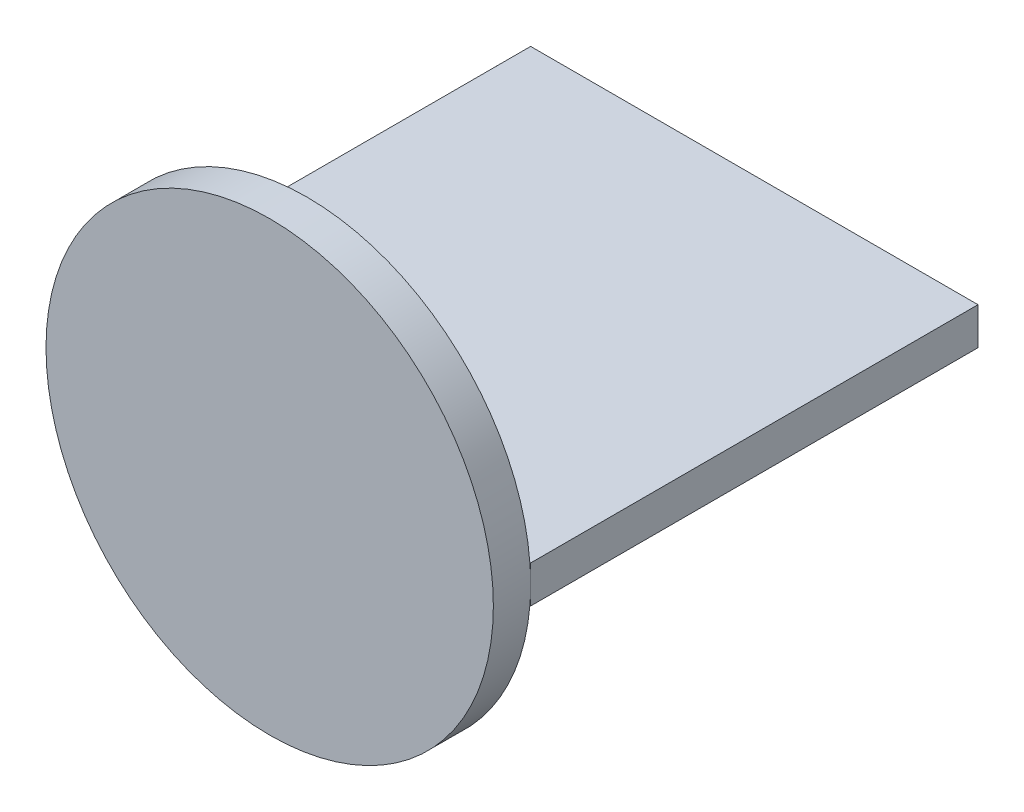
ISO-10303-21;
HEADER;
FILE_DESCRIPTION(('STEP AP214'),'2;1');
FILE_NAME('part.step','',(''),(''),'','','');
FILE_SCHEMA(('AUTOMOTIVE_DESIGN { 1 0 10303 214 1 1 1 1 }'));
ENDSEC;
DATA;
#1=APPLICATION_CONTEXT('core data for automotive mechanical design processes');
#2=APPLICATION_PROTOCOL_DEFINITION('international standard','automotive_design',2000,#1);
#3=PRODUCT_CONTEXT('',#1,'mechanical');
#4=PRODUCT('Part','Part','',(#3));
#5=PRODUCT_RELATED_PRODUCT_CATEGORY('part','',(#4));
#6=PRODUCT_DEFINITION_FORMATION('','',#4);
#7=PRODUCT_DEFINITION_CONTEXT('part definition',#1,'design');
#8=PRODUCT_DEFINITION('design','',#6,#7);
#9=PRODUCT_DEFINITION_SHAPE('','',#8);
#10=(LENGTH_UNIT() NAMED_UNIT(*) SI_UNIT(.MILLI.,.METRE.));
#11=(NAMED_UNIT(*) PLANE_ANGLE_UNIT() SI_UNIT($,.RADIAN.));
#12=(NAMED_UNIT(*) SI_UNIT($,.STERADIAN.) SOLID_ANGLE_UNIT());
#13=UNCERTAINTY_MEASURE_WITH_UNIT(LENGTH_MEASURE(1.E-05),#10,'distance_accuracy_value','');
#14=(GEOMETRIC_REPRESENTATION_CONTEXT(3) GLOBAL_UNCERTAINTY_ASSIGNED_CONTEXT((#13)) GLOBAL_UNIT_ASSIGNED_CONTEXT((#10,
#11,#12)) REPRESENTATION_CONTEXT('',''));
#15=CARTESIAN_POINT('',(0.,0.,0.));
#16=DIRECTION('',(0.,0.,1.));
#17=DIRECTION('',(1.,0.,0.));
#18=AXIS2_PLACEMENT_3D('',#15,#16,#17);
#19=CARTESIAN_POINT('',(0.,0.,10.));
#20=DIRECTION('',(0.,0.,-1.));
#21=DIRECTION('',(-1.,0.,0.));
#22=AXIS2_PLACEMENT_3D('',#19,#20,#21);
#23=CYLINDRICAL_SURFACE('',#22,30.);
#24=CARTESIAN_POINT('',(0.,0.,0.));
#25=DIRECTION('',(0.,0.,1.));
#26=DIRECTION('',(1.,0.,0.));
#27=AXIS2_PLACEMENT_3D('',#24,#25,#26);
#28=CIRCLE('',#27,30.);
#29=CARTESIAN_POINT('',(30.,0.,0.));
#30=VERTEX_POINT('',#29);
#31=CARTESIAN_POINT('',(29.8956518577535,2.5,0.));
#32=VERTEX_POINT('',#31);
#33=EDGE_CURVE('E80',#30,#32,#28,.T.);
#34=ORIENTED_EDGE('',*,*,#33,.T.);
#35=CARTESIAN_POINT('',(-29.8956518577535,2.5,0.));
#36=VERTEX_POINT('',#35);
#37=EDGE_CURVE('E202',#32,#36,#28,.T.);
#38=ORIENTED_EDGE('',*,*,#37,.T.);
#39=CARTESIAN_POINT('',(-30.,0.,0.));
#40=VERTEX_POINT('',#39);
#41=EDGE_CURVE('E101',#36,#40,#28,.T.);
#42=ORIENTED_EDGE('',*,*,#41,.T.);
#43=CARTESIAN_POINT('',(-29.8956518577535,-2.5,0.));
#44=VERTEX_POINT('',#43);
#45=EDGE_CURVE('E220',#40,#44,#28,.T.);
#46=ORIENTED_EDGE('',*,*,#45,.T.);
#47=CARTESIAN_POINT('',(29.8956518577535,-2.5,0.));
#48=VERTEX_POINT('',#47);
#49=EDGE_CURVE('E221',#44,#48,#28,.T.);
#50=ORIENTED_EDGE('',*,*,#49,.T.);
#51=EDGE_CURVE('E185',#48,#30,#28,.T.);
#52=ORIENTED_EDGE('',*,*,#51,.T.);
#53=EDGE_LOOP('',(#34,#38,#42,#46,#50,#52));
#54=FACE_BOUND('',#53,.T.);
#55=CARTESIAN_POINT('',(0.,0.,5.));
#56=DIRECTION('',(0.,0.,1.));
#57=DIRECTION('',(1.,0.,0.));
#58=AXIS2_PLACEMENT_3D('',#55,#56,#57);
#59=CIRCLE('',#58,30.);
#60=CARTESIAN_POINT('',(30.,0.,5.));
#61=VERTEX_POINT('',#60);
#62=EDGE_CURVE('E187',#61,#61,#59,.T.);
#63=ORIENTED_EDGE('',*,*,#62,.F.);
#64=EDGE_LOOP('',(#63));
#65=FACE_BOUND('',#64,.T.);
#66=ADVANCED_FACE('F77',(#54,#65),#23,.T.);
#67=CARTESIAN_POINT('',(0.,0.,0.));
#68=DIRECTION('',(0.,0.,1.));
#69=DIRECTION('',(1.,0.,0.));
#70=AXIS2_PLACEMENT_3D('',#67,#68,#69);
#71=PLANE('',#70);
#72=DIRECTION('',(-1.,0.,0.));
#73=VECTOR('',#72,1.);
#74=CARTESIAN_POINT('',(0.,-2.5,0.));
#75=LINE('',#74,#73);
#76=EDGE_CURVE('E85',#48,#44,#75,.T.);
#77=ORIENTED_EDGE('',*,*,#76,.F.);
#78=ORIENTED_EDGE('',*,*,#49,.F.);
#79=EDGE_LOOP('',(#77,#78));
#80=FACE_BOUND('',#79,.T.);
#81=ADVANCED_FACE('F194',(#80),#71,.F.);
#82=ORIENTED_EDGE('',*,*,#37,.F.);
#83=DIRECTION('',(-1.,0.,0.));
#84=VECTOR('',#83,1.);
#85=CARTESIAN_POINT('',(0.,2.5,0.));
#86=LINE('',#85,#84);
#87=EDGE_CURVE('E12',#32,#36,#86,.T.);
#88=ORIENTED_EDGE('',*,*,#87,.T.);
#89=EDGE_LOOP('',(#82,#88));
#90=FACE_BOUND('',#89,.T.);
#91=ADVANCED_FACE('F198',(#90),#71,.F.);
#92=CARTESIAN_POINT('',(0.,0.,0.));
#93=DIRECTION('',(0.,0.,-1.));
#94=DIRECTION('',(-1.,0.,0.));
#95=AXIS2_PLACEMENT_3D('',#92,#93,#94);
#96=PLANE('',#95);
#97=ORIENTED_EDGE('',*,*,#41,.F.);
#98=CARTESIAN_POINT('',(-30.,2.5,0.));
#99=VERTEX_POINT('',#98);
#100=EDGE_CURVE('E88',#36,#99,#86,.T.);
#101=ORIENTED_EDGE('',*,*,#100,.T.);
#102=DIRECTION('',(0.,1.,0.));
#103=VECTOR('',#102,1.);
#104=CARTESIAN_POINT('',(-30.,-2.5,0.));
#105=LINE('',#104,#103);
#106=EDGE_CURVE('E166',#40,#99,#105,.T.);
#107=ORIENTED_EDGE('',*,*,#106,.F.);
#108=EDGE_LOOP('',(#97,#101,#107));
#109=FACE_BOUND('',#108,.T.);
#110=ADVANCED_FACE('F223',(#109),#96,.F.);
#111=ORIENTED_EDGE('',*,*,#45,.F.);
#112=CARTESIAN_POINT('',(-30.,-2.5,0.));
#113=VERTEX_POINT('',#112);
#114=EDGE_CURVE('E179',#113,#40,#105,.T.);
#115=ORIENTED_EDGE('',*,*,#114,.F.);
#116=EDGE_CURVE('E182',#44,#113,#75,.T.);
#117=ORIENTED_EDGE('',*,*,#116,.F.);
#118=EDGE_LOOP('',(#111,#115,#117));
#119=FACE_BOUND('',#118,.T.);
#120=ADVANCED_FACE('F219',(#119),#96,.F.);
#121=ORIENTED_EDGE('',*,*,#33,.F.);
#122=DIRECTION('',(0.,1.,0.));
#123=VECTOR('',#122,1.);
#124=CARTESIAN_POINT('',(30.,-2.5,0.));
#125=LINE('',#124,#123);
#126=CARTESIAN_POINT('',(30.,2.5,0.));
#127=VERTEX_POINT('',#126);
#128=EDGE_CURVE('E178',#30,#127,#125,.T.);
#129=ORIENTED_EDGE('',*,*,#128,.T.);
#130=EDGE_CURVE('E87',#127,#32,#86,.T.);
#131=ORIENTED_EDGE('',*,*,#130,.T.);
#132=EDGE_LOOP('',(#121,#129,#131));
#133=FACE_BOUND('',#132,.T.);
#134=ADVANCED_FACE('F207',(#133),#96,.F.);
#135=ORIENTED_EDGE('',*,*,#51,.F.);
#136=CARTESIAN_POINT('',(30.,-2.5,0.));
#137=VERTEX_POINT('',#136);
#138=EDGE_CURVE('E152',#137,#48,#75,.T.);
#139=ORIENTED_EDGE('',*,*,#138,.F.);
#140=EDGE_CURVE('E161',#137,#30,#125,.T.);
#141=ORIENTED_EDGE('',*,*,#140,.T.);
#142=EDGE_LOOP('',(#135,#139,#141));
#143=FACE_BOUND('',#142,.T.);
#144=ADVANCED_FACE('F213',(#143),#96,.F.);
#145=CARTESIAN_POINT('',(0.,-2.5,-60.));
#146=DIRECTION('',(0.,1.,0.));
#147=DIRECTION('',(0.,0.,1.));
#148=AXIS2_PLACEMENT_3D('',#145,#146,#147);
#149=PLANE('',#148);
#150=ORIENTED_EDGE('',*,*,#138,.T.);
#151=ORIENTED_EDGE('',*,*,#76,.T.);
#152=ORIENTED_EDGE('',*,*,#116,.T.);
#153=DIRECTION('',(0.,0.,1.));
#154=VECTOR('',#153,1.);
#155=CARTESIAN_POINT('',(-30.,-2.5,-60.));
#156=LINE('',#155,#154);
#157=CARTESIAN_POINT('',(-30.,-2.5,-60.));
#158=VERTEX_POINT('',#157);
#159=EDGE_CURVE('E168',#158,#113,#156,.T.);
#160=ORIENTED_EDGE('',*,*,#159,.F.);
#161=DIRECTION('',(-1.,0.,0.));
#162=VECTOR('',#161,1.);
#163=CARTESIAN_POINT('',(0.,-2.5,-60.));
#164=LINE('',#163,#162);
#165=CARTESIAN_POINT('',(30.,-2.5,-60.));
#166=VERTEX_POINT('',#165);
#167=EDGE_CURVE('E151',#166,#158,#164,.T.);
#168=ORIENTED_EDGE('',*,*,#167,.F.);
#169=DIRECTION('',(0.,0.,1.));
#170=VECTOR('',#169,1.);
#171=CARTESIAN_POINT('',(30.,-2.5,-60.));
#172=LINE('',#171,#170);
#173=EDGE_CURVE('E169',#166,#137,#172,.T.);
#174=ORIENTED_EDGE('',*,*,#173,.T.);
#175=EDGE_LOOP('',(#150,#151,#152,#160,#168,#174));
#176=FACE_BOUND('',#175,.T.);
#177=ADVANCED_FACE('F215',(#176),#149,.F.);
#178=CARTESIAN_POINT('',(0.,2.5,-60.));
#179=DIRECTION('',(0.,1.,0.));
#180=DIRECTION('',(0.,0.,1.));
#181=AXIS2_PLACEMENT_3D('',#178,#179,#180);
#182=PLANE('',#181);
#183=ORIENTED_EDGE('',*,*,#130,.F.);
#184=DIRECTION('',(0.,0.,1.));
#185=VECTOR('',#184,1.);
#186=CARTESIAN_POINT('',(30.,2.5,-60.));
#187=LINE('',#186,#185);
#188=CARTESIAN_POINT('',(30.,2.5,-60.));
#189=VERTEX_POINT('',#188);
#190=EDGE_CURVE('E147',#189,#127,#187,.T.);
#191=ORIENTED_EDGE('',*,*,#190,.F.);
#192=DIRECTION('',(-1.,0.,0.));
#193=VECTOR('',#192,1.);
#194=CARTESIAN_POINT('',(0.,2.5,-60.));
#195=LINE('',#194,#193);
#196=CARTESIAN_POINT('',(-30.,2.5,-60.));
#197=VERTEX_POINT('',#196);
#198=EDGE_CURVE('E139',#189,#197,#195,.T.);
#199=ORIENTED_EDGE('',*,*,#198,.T.);
#200=DIRECTION('',(0.,0.,1.));
#201=VECTOR('',#200,1.);
#202=CARTESIAN_POINT('',(-30.,2.5,-60.));
#203=LINE('',#202,#201);
#204=EDGE_CURVE('E145',#197,#99,#203,.T.);
#205=ORIENTED_EDGE('',*,*,#204,.T.);
#206=ORIENTED_EDGE('',*,*,#100,.F.);
#207=ORIENTED_EDGE('',*,*,#87,.F.);
#208=EDGE_LOOP('',(#183,#191,#199,#205,#206,#207));
#209=FACE_BOUND('',#208,.T.);
#210=ADVANCED_FACE('F142',(#209),#182,.T.);
#211=CARTESIAN_POINT('',(0.,0.,-60.));
#212=DIRECTION('',(0.,0.,-1.));
#213=DIRECTION('',(-1.,0.,0.));
#214=AXIS2_PLACEMENT_3D('',#211,#212,#213);
#215=PLANE('',#214);
#216=ORIENTED_EDGE('',*,*,#198,.F.);
#217=DIRECTION('',(0.,1.,0.));
#218=VECTOR('',#217,1.);
#219=CARTESIAN_POINT('',(30.,-2.5,-60.));
#220=LINE('',#219,#218);
#221=EDGE_CURVE('E160',#166,#189,#220,.T.);
#222=ORIENTED_EDGE('',*,*,#221,.F.);
#223=ORIENTED_EDGE('',*,*,#167,.T.);
#224=DIRECTION('',(0.,1.,0.));
#225=VECTOR('',#224,1.);
#226=CARTESIAN_POINT('',(-30.,-2.5,-60.));
#227=LINE('',#226,#225);
#228=EDGE_CURVE('E155',#158,#197,#227,.T.);
#229=ORIENTED_EDGE('',*,*,#228,.T.);
#230=EDGE_LOOP('',(#216,#222,#223,#229));
#231=FACE_BOUND('',#230,.T.);
#232=ADVANCED_FACE('F156',(#231),#215,.T.);
#233=CARTESIAN_POINT('',(-30.,-2.5,-60.));
#234=DIRECTION('',(1.,0.,0.));
#235=DIRECTION('',(0.,0.,-1.));
#236=AXIS2_PLACEMENT_3D('',#233,#234,#235);
#237=PLANE('',#236);
#238=ORIENTED_EDGE('',*,*,#114,.T.);
#239=ORIENTED_EDGE('',*,*,#106,.T.);
#240=ORIENTED_EDGE('',*,*,#204,.F.);
#241=ORIENTED_EDGE('',*,*,#228,.F.);
#242=ORIENTED_EDGE('',*,*,#159,.T.);
#243=EDGE_LOOP('',(#238,#239,#240,#241,#242));
#244=FACE_BOUND('',#243,.T.);
#245=ADVANCED_FACE('F164',(#244),#237,.F.);
#246=CARTESIAN_POINT('',(30.,-2.5,-60.));
#247=DIRECTION('',(1.,0.,0.));
#248=DIRECTION('',(0.,0.,-1.));
#249=AXIS2_PLACEMENT_3D('',#246,#247,#248);
#250=PLANE('',#249);
#251=ORIENTED_EDGE('',*,*,#140,.F.);
#252=ORIENTED_EDGE('',*,*,#173,.F.);
#253=ORIENTED_EDGE('',*,*,#221,.T.);
#254=ORIENTED_EDGE('',*,*,#190,.T.);
#255=ORIENTED_EDGE('',*,*,#128,.F.);
#256=EDGE_LOOP('',(#251,#252,#253,#254,#255));
#257=FACE_BOUND('',#256,.T.);
#258=ADVANCED_FACE('F210',(#257),#250,.T.);
#259=CARTESIAN_POINT('',(0.,0.,5.));
#260=DIRECTION('',(0.,0.,1.));
#261=DIRECTION('',(1.,0.,0.));
#262=AXIS2_PLACEMENT_3D('',#259,#260,#261);
#263=PLANE('',#262);
#264=ORIENTED_EDGE('',*,*,#62,.T.);
#265=EDGE_LOOP('',(#264));
#266=FACE_BOUND('',#265,.T.);
#267=ADVANCED_FACE('F191',(#266),#263,.T.);
#268=CLOSED_SHELL('',(#66,#81,#91,#110,#120,#134,#144,#177,#210,#232,#245,#258,#267));
#269=MANIFOLD_SOLID_BREP('B2',#268);
#270=ADVANCED_BREP_SHAPE_REPRESENTATION('',(#18,#269),#14);
#271=SHAPE_DEFINITION_REPRESENTATION(#9,#270);
ENDSEC;
END-ISO-10303-21;
